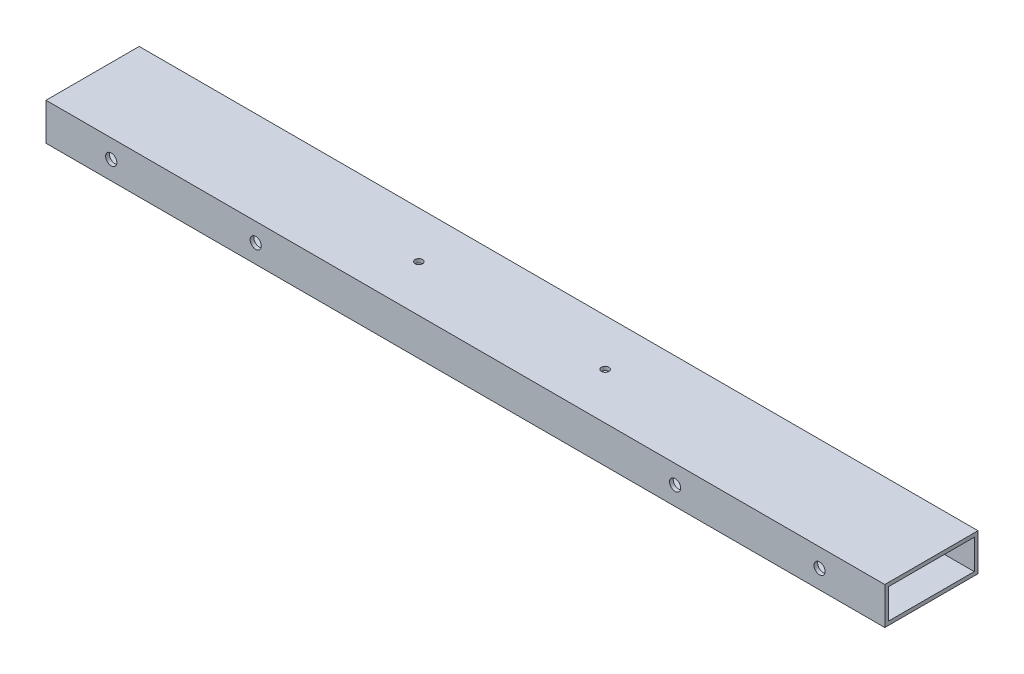
ISO-10303-21;
HEADER;
FILE_DESCRIPTION(('STEP AP214'),'2;1');
FILE_NAME('part.step','',(''),(''),'','','');
FILE_SCHEMA(('AUTOMOTIVE_DESIGN { 1 0 10303 214 1 1 1 1 }'));
ENDSEC;
DATA;
#1=APPLICATION_CONTEXT('core data for automotive mechanical design processes');
#2=APPLICATION_PROTOCOL_DEFINITION('international standard','automotive_design',2000,#1);
#3=PRODUCT_CONTEXT('',#1,'mechanical');
#4=PRODUCT('Part','Part','',(#3));
#5=PRODUCT_RELATED_PRODUCT_CATEGORY('part','',(#4));
#6=PRODUCT_DEFINITION_FORMATION('','',#4);
#7=PRODUCT_DEFINITION_CONTEXT('part definition',#1,'design');
#8=PRODUCT_DEFINITION('design','',#6,#7);
#9=PRODUCT_DEFINITION_SHAPE('','',#8);
#10=(LENGTH_UNIT() NAMED_UNIT(*) SI_UNIT(.MILLI.,.METRE.));
#11=(NAMED_UNIT(*) PLANE_ANGLE_UNIT() SI_UNIT($,.RADIAN.));
#12=(NAMED_UNIT(*) SI_UNIT($,.STERADIAN.) SOLID_ANGLE_UNIT());
#13=UNCERTAINTY_MEASURE_WITH_UNIT(LENGTH_MEASURE(1.E-05),#10,'distance_accuracy_value','');
#14=(GEOMETRIC_REPRESENTATION_CONTEXT(3) GLOBAL_UNCERTAINTY_ASSIGNED_CONTEXT((#13)) GLOBAL_UNIT_ASSIGNED_CONTEXT((#10,
#11,#12)) REPRESENTATION_CONTEXT('',''));
#15=CARTESIAN_POINT('',(0.,0.,0.));
#16=DIRECTION('',(0.,0.,1.));
#17=DIRECTION('',(1.,0.,0.));
#18=AXIS2_PLACEMENT_3D('',#15,#16,#17);
#19=CARTESIAN_POINT('',(450.,0.,0.));
#20=DIRECTION('',(1.,0.,0.));
#21=DIRECTION('',(0.,0.,-1.));
#22=AXIS2_PLACEMENT_3D('',#19,#20,#21);
#23=PLANE('',#22);
#24=DIRECTION('',(0.,1.,0.));
#25=VECTOR('',#24,1.);
#26=CARTESIAN_POINT('',(450.,10.,-25.));
#27=LINE('',#26,#25);
#28=CARTESIAN_POINT('',(450.,-10.,-25.));
#29=VERTEX_POINT('',#28);
#30=CARTESIAN_POINT('',(450.,10.,-25.));
#31=VERTEX_POINT('',#30);
#32=EDGE_CURVE('E141',#29,#31,#27,.T.);
#33=ORIENTED_EDGE('',*,*,#32,.T.);
#34=DIRECTION('',(0.,0.,1.));
#35=VECTOR('',#34,1.);
#36=CARTESIAN_POINT('',(450.,10.,25.));
#37=LINE('',#36,#35);
#38=CARTESIAN_POINT('',(450.,10.,25.));
#39=VERTEX_POINT('',#38);
#40=EDGE_CURVE('E144',#31,#39,#37,.T.);
#41=ORIENTED_EDGE('',*,*,#40,.T.);
#42=DIRECTION('',(0.,-1.,0.));
#43=VECTOR('',#42,1.);
#44=CARTESIAN_POINT('',(450.,10.,25.));
#45=LINE('',#44,#43);
#46=CARTESIAN_POINT('',(450.,-10.,25.));
#47=VERTEX_POINT('',#46);
#48=EDGE_CURVE('E147',#39,#47,#45,.T.);
#49=ORIENTED_EDGE('',*,*,#48,.T.);
#50=DIRECTION('',(0.,0.,-1.));
#51=VECTOR('',#50,1.);
#52=CARTESIAN_POINT('',(450.,-10.,25.));
#53=LINE('',#52,#51);
#54=EDGE_CURVE('E149',#47,#29,#53,.T.);
#55=ORIENTED_EDGE('',*,*,#54,.T.);
#56=EDGE_LOOP('',(#33,#41,#49,#55));
#57=FACE_BOUND('',#56,.T.);
#58=DIRECTION('',(0.,0.,1.));
#59=VECTOR('',#58,1.);
#60=CARTESIAN_POINT('',(450.,8.,23.));
#61=LINE('',#60,#59);
#62=CARTESIAN_POINT('',(450.,8.,-23.));
#63=VERTEX_POINT('',#62);
#64=CARTESIAN_POINT('',(450.,8.,23.));
#65=VERTEX_POINT('',#64);
#66=EDGE_CURVE('E111',#63,#65,#61,.T.);
#67=ORIENTED_EDGE('',*,*,#66,.F.);
#68=DIRECTION('',(0.,1.,0.));
#69=VECTOR('',#68,1.);
#70=CARTESIAN_POINT('',(450.,-8.,-23.));
#71=LINE('',#70,#69);
#72=CARTESIAN_POINT('',(450.,-8.,-23.));
#73=VERTEX_POINT('',#72);
#74=EDGE_CURVE('E103',#73,#63,#71,.T.);
#75=ORIENTED_EDGE('',*,*,#74,.F.);
#76=DIRECTION('',(0.,0.,-1.));
#77=VECTOR('',#76,1.);
#78=CARTESIAN_POINT('',(450.,-8.,23.));
#79=LINE('',#78,#77);
#80=CARTESIAN_POINT('',(450.,-8.,23.));
#81=VERTEX_POINT('',#80);
#82=EDGE_CURVE('E125',#81,#73,#79,.T.);
#83=ORIENTED_EDGE('',*,*,#82,.F.);
#84=DIRECTION('',(0.,-1.,0.));
#85=VECTOR('',#84,1.);
#86=CARTESIAN_POINT('',(450.,-8.,23.));
#87=LINE('',#86,#85);
#88=EDGE_CURVE('E123',#65,#81,#87,.T.);
#89=ORIENTED_EDGE('',*,*,#88,.F.);
#90=EDGE_LOOP('',(#67,#75,#83,#89));
#91=FACE_BOUND('',#90,.T.);
#92=ADVANCED_FACE('F36',(#57,#91),#23,.T.);
#93=CARTESIAN_POINT('',(0.,0.,0.));
#94=DIRECTION('',(1.,0.,0.));
#95=DIRECTION('',(0.,0.,-1.));
#96=AXIS2_PLACEMENT_3D('',#93,#94,#95);
#97=PLANE('',#96);
#98=DIRECTION('',(0.,1.,0.));
#99=VECTOR('',#98,1.);
#100=CARTESIAN_POINT('',(0.,10.,-25.));
#101=LINE('',#100,#99);
#102=CARTESIAN_POINT('',(0.,-10.,-25.));
#103=VERTEX_POINT('',#102);
#104=CARTESIAN_POINT('',(0.,10.,-25.));
#105=VERTEX_POINT('',#104);
#106=EDGE_CURVE('E119',#103,#105,#101,.T.);
#107=ORIENTED_EDGE('',*,*,#106,.F.);
#108=DIRECTION('',(0.,0.,-1.));
#109=VECTOR('',#108,1.);
#110=CARTESIAN_POINT('',(0.,-10.,25.));
#111=LINE('',#110,#109);
#112=CARTESIAN_POINT('',(0.,-10.,25.));
#113=VERTEX_POINT('',#112);
#114=EDGE_CURVE('E145',#113,#103,#111,.T.);
#115=ORIENTED_EDGE('',*,*,#114,.F.);
#116=DIRECTION('',(0.,-1.,0.));
#117=VECTOR('',#116,1.);
#118=CARTESIAN_POINT('',(0.,10.,25.));
#119=LINE('',#118,#117);
#120=CARTESIAN_POINT('',(0.,10.,25.));
#121=VERTEX_POINT('',#120);
#122=EDGE_CURVE('E156',#121,#113,#119,.T.);
#123=ORIENTED_EDGE('',*,*,#122,.F.);
#124=DIRECTION('',(0.,0.,1.));
#125=VECTOR('',#124,1.);
#126=CARTESIAN_POINT('',(0.,10.,25.));
#127=LINE('',#126,#125);
#128=EDGE_CURVE('E154',#105,#121,#127,.T.);
#129=ORIENTED_EDGE('',*,*,#128,.F.);
#130=EDGE_LOOP('',(#107,#115,#123,#129));
#131=FACE_BOUND('',#130,.T.);
#132=DIRECTION('',(0.,1.,0.));
#133=VECTOR('',#132,1.);
#134=CARTESIAN_POINT('',(0.,-8.,-23.));
#135=LINE('',#134,#133);
#136=CARTESIAN_POINT('',(0.,-8.,-23.));
#137=VERTEX_POINT('',#136);
#138=CARTESIAN_POINT('',(0.,8.,-23.));
#139=VERTEX_POINT('',#138);
#140=EDGE_CURVE('E61',#137,#139,#135,.T.);
#141=ORIENTED_EDGE('',*,*,#140,.T.);
#142=DIRECTION('',(0.,0.,1.));
#143=VECTOR('',#142,1.);
#144=CARTESIAN_POINT('',(0.,8.,23.));
#145=LINE('',#144,#143);
#146=CARTESIAN_POINT('',(0.,8.,23.));
#147=VERTEX_POINT('',#146);
#148=EDGE_CURVE('E118',#139,#147,#145,.T.);
#149=ORIENTED_EDGE('',*,*,#148,.T.);
#150=DIRECTION('',(0.,-1.,0.));
#151=VECTOR('',#150,1.);
#152=CARTESIAN_POINT('',(0.,-8.,23.));
#153=LINE('',#152,#151);
#154=CARTESIAN_POINT('',(0.,-8.,23.));
#155=VERTEX_POINT('',#154);
#156=EDGE_CURVE('E133',#147,#155,#153,.T.);
#157=ORIENTED_EDGE('',*,*,#156,.T.);
#158=DIRECTION('',(0.,0.,-1.));
#159=VECTOR('',#158,1.);
#160=CARTESIAN_POINT('',(0.,-8.,23.));
#161=LINE('',#160,#159);
#162=EDGE_CURVE('E112',#155,#137,#161,.T.);
#163=ORIENTED_EDGE('',*,*,#162,.T.);
#164=EDGE_LOOP('',(#141,#149,#157,#163));
#165=FACE_BOUND('',#164,.T.);
#166=ADVANCED_FACE('F262',(#131,#165),#97,.F.);
#167=CARTESIAN_POINT('',(450.,10.,-25.));
#168=DIRECTION('',(0.,0.,1.));
#169=DIRECTION('',(1.,0.,0.));
#170=AXIS2_PLACEMENT_3D('',#167,#168,#169);
#171=PLANE('',#170);
#172=CARTESIAN_POINT('',(415.,0.,-25.));
#173=DIRECTION('',(0.,0.,-1.));
#174=DIRECTION('',(-1.,0.,0.));
#175=AXIS2_PLACEMENT_3D('',#172,#173,#174);
#176=CIRCLE('',#175,2.99999999999999);
#177=CARTESIAN_POINT('',(412.,0.,-25.));
#178=VERTEX_POINT('',#177);
#179=EDGE_CURVE('E207',#178,#178,#176,.T.);
#180=ORIENTED_EDGE('',*,*,#179,.F.);
#181=EDGE_LOOP('',(#180));
#182=FACE_BOUND('',#181,.T.);
#183=CARTESIAN_POINT('',(337.5,0.,-25.));
#184=DIRECTION('',(0.,0.,-1.));
#185=DIRECTION('',(-1.,0.,0.));
#186=AXIS2_PLACEMENT_3D('',#183,#184,#185);
#187=CIRCLE('',#186,2.99999999999999);
#188=CARTESIAN_POINT('',(334.5,0.,-25.));
#189=VERTEX_POINT('',#188);
#190=EDGE_CURVE('E213',#189,#189,#187,.T.);
#191=ORIENTED_EDGE('',*,*,#190,.F.);
#192=EDGE_LOOP('',(#191));
#193=FACE_BOUND('',#192,.T.);
#194=CARTESIAN_POINT('',(112.5,0.,-25.));
#195=DIRECTION('',(0.,0.,-1.));
#196=DIRECTION('',(-1.,0.,0.));
#197=AXIS2_PLACEMENT_3D('',#194,#195,#196);
#198=CIRCLE('',#197,2.99999999999999);
#199=CARTESIAN_POINT('',(109.5,0.,-25.));
#200=VERTEX_POINT('',#199);
#201=EDGE_CURVE('E219',#200,#200,#198,.T.);
#202=ORIENTED_EDGE('',*,*,#201,.F.);
#203=EDGE_LOOP('',(#202));
#204=FACE_BOUND('',#203,.T.);
#205=CARTESIAN_POINT('',(35.,0.,-25.));
#206=DIRECTION('',(0.,0.,-1.));
#207=DIRECTION('',(-1.,0.,0.));
#208=AXIS2_PLACEMENT_3D('',#205,#206,#207);
#209=CIRCLE('',#208,2.99999999999999);
#210=CARTESIAN_POINT('',(32.,0.,-25.));
#211=VERTEX_POINT('',#210);
#212=EDGE_CURVE('E206',#211,#211,#209,.T.);
#213=ORIENTED_EDGE('',*,*,#212,.F.);
#214=EDGE_LOOP('',(#213));
#215=FACE_BOUND('',#214,.T.);
#216=ORIENTED_EDGE('',*,*,#106,.T.);
#217=DIRECTION('',(-1.,0.,0.));
#218=VECTOR('',#217,1.);
#219=CARTESIAN_POINT('',(450.,10.,-25.));
#220=LINE('',#219,#218);
#221=EDGE_CURVE('E11',#31,#105,#220,.T.);
#222=ORIENTED_EDGE('',*,*,#221,.F.);
#223=ORIENTED_EDGE('',*,*,#32,.F.);
#224=DIRECTION('',(-1.,0.,0.));
#225=VECTOR('',#224,1.);
#226=CARTESIAN_POINT('',(450.,-10.,-25.));
#227=LINE('',#226,#225);
#228=EDGE_CURVE('E151',#29,#103,#227,.T.);
#229=ORIENTED_EDGE('',*,*,#228,.T.);
#230=EDGE_LOOP('',(#216,#222,#223,#229));
#231=FACE_BOUND('',#230,.T.);
#232=ADVANCED_FACE('F38',(#182,#193,#204,#215,#231),#171,.F.);
#233=CARTESIAN_POINT('',(450.,10.,25.));
#234=DIRECTION('',(0.,-1.,0.));
#235=DIRECTION('',(0.,0.,-1.));
#236=AXIS2_PLACEMENT_3D('',#233,#234,#235);
#237=PLANE('',#236);
#238=CARTESIAN_POINT('',(175.,10.,0.));
#239=DIRECTION('',(0.,1.,0.));
#240=DIRECTION('',(0.,0.,1.));
#241=AXIS2_PLACEMENT_3D('',#238,#239,#240);
#242=CIRCLE('',#241,2.);
#243=CARTESIAN_POINT('',(175.,10.,2.));
#244=VERTEX_POINT('',#243);
#245=EDGE_CURVE('E190',#244,#244,#242,.T.);
#246=ORIENTED_EDGE('',*,*,#245,.F.);
#247=EDGE_LOOP('',(#246));
#248=FACE_BOUND('',#247,.T.);
#249=CARTESIAN_POINT('',(275.,10.,0.));
#250=DIRECTION('',(0.,1.,0.));
#251=DIRECTION('',(0.,0.,1.));
#252=AXIS2_PLACEMENT_3D('',#249,#250,#251);
#253=CIRCLE('',#252,2.);
#254=CARTESIAN_POINT('',(275.,10.,2.));
#255=VERTEX_POINT('',#254);
#256=EDGE_CURVE('E198',#255,#255,#253,.T.);
#257=ORIENTED_EDGE('',*,*,#256,.F.);
#258=EDGE_LOOP('',(#257));
#259=FACE_BOUND('',#258,.T.);
#260=ORIENTED_EDGE('',*,*,#128,.T.);
#261=DIRECTION('',(-1.,0.,0.));
#262=VECTOR('',#261,1.);
#263=CARTESIAN_POINT('',(450.,10.,25.));
#264=LINE('',#263,#262);
#265=EDGE_CURVE('E45',#39,#121,#264,.T.);
#266=ORIENTED_EDGE('',*,*,#265,.F.);
#267=ORIENTED_EDGE('',*,*,#40,.F.);
#268=ORIENTED_EDGE('',*,*,#221,.T.);
#269=EDGE_LOOP('',(#260,#266,#267,#268));
#270=FACE_BOUND('',#269,.T.);
#271=ADVANCED_FACE('F261',(#248,#259,#270),#237,.F.);
#272=CARTESIAN_POINT('',(450.,10.,25.));
#273=DIRECTION('',(0.,0.,-1.));
#274=DIRECTION('',(-1.,0.,0.));
#275=AXIS2_PLACEMENT_3D('',#272,#273,#274);
#276=PLANE('',#275);
#277=CARTESIAN_POINT('',(415.,0.,25.));
#278=DIRECTION('',(0.,0.,-1.));
#279=DIRECTION('',(-1.,0.,0.));
#280=AXIS2_PLACEMENT_3D('',#277,#278,#279);
#281=CIRCLE('',#280,2.99999999999999);
#282=CARTESIAN_POINT('',(412.,0.,25.));
#283=VERTEX_POINT('',#282);
#284=EDGE_CURVE('E170',#283,#283,#281,.F.);
#285=ORIENTED_EDGE('',*,*,#284,.F.);
#286=EDGE_LOOP('',(#285));
#287=FACE_BOUND('',#286,.T.);
#288=CARTESIAN_POINT('',(337.5,0.,25.));
#289=DIRECTION('',(0.,0.,-1.));
#290=DIRECTION('',(-1.,0.,0.));
#291=AXIS2_PLACEMENT_3D('',#288,#289,#290);
#292=CIRCLE('',#291,2.99999999999999);
#293=CARTESIAN_POINT('',(334.5,0.,25.));
#294=VERTEX_POINT('',#293);
#295=EDGE_CURVE('E210',#294,#294,#292,.F.);
#296=ORIENTED_EDGE('',*,*,#295,.F.);
#297=EDGE_LOOP('',(#296));
#298=FACE_BOUND('',#297,.T.);
#299=CARTESIAN_POINT('',(112.5,0.,25.));
#300=DIRECTION('',(0.,0.,-1.));
#301=DIRECTION('',(-1.,0.,0.));
#302=AXIS2_PLACEMENT_3D('',#299,#300,#301);
#303=CIRCLE('',#302,2.99999999999999);
#304=CARTESIAN_POINT('',(109.5,0.,25.));
#305=VERTEX_POINT('',#304);
#306=EDGE_CURVE('E216',#305,#305,#303,.F.);
#307=ORIENTED_EDGE('',*,*,#306,.F.);
#308=EDGE_LOOP('',(#307));
#309=FACE_BOUND('',#308,.T.);
#310=CARTESIAN_POINT('',(35.,0.,25.));
#311=DIRECTION('',(0.,0.,-1.));
#312=DIRECTION('',(-1.,0.,0.));
#313=AXIS2_PLACEMENT_3D('',#310,#311,#312);
#314=CIRCLE('',#313,2.99999999999999);
#315=CARTESIAN_POINT('',(32.,0.,25.));
#316=VERTEX_POINT('',#315);
#317=EDGE_CURVE('E222',#316,#316,#314,.F.);
#318=ORIENTED_EDGE('',*,*,#317,.F.);
#319=EDGE_LOOP('',(#318));
#320=FACE_BOUND('',#319,.T.);
#321=ORIENTED_EDGE('',*,*,#122,.T.);
#322=DIRECTION('',(-1.,0.,0.));
#323=VECTOR('',#322,1.);
#324=CARTESIAN_POINT('',(450.,-10.,25.));
#325=LINE('',#324,#323);
#326=EDGE_CURVE('E161',#47,#113,#325,.T.);
#327=ORIENTED_EDGE('',*,*,#326,.F.);
#328=ORIENTED_EDGE('',*,*,#48,.F.);
#329=ORIENTED_EDGE('',*,*,#265,.T.);
#330=EDGE_LOOP('',(#321,#327,#328,#329));
#331=FACE_BOUND('',#330,.T.);
#332=ADVANCED_FACE('F280',(#287,#298,#309,#320,#331),#276,.F.);
#333=CARTESIAN_POINT('',(450.,-10.,25.));
#334=DIRECTION('',(0.,1.,0.));
#335=DIRECTION('',(0.,0.,1.));
#336=AXIS2_PLACEMENT_3D('',#333,#334,#335);
#337=PLANE('',#336);
#338=CARTESIAN_POINT('',(175.,-10.,0.));
#339=DIRECTION('',(0.,1.,0.));
#340=DIRECTION('',(0.,0.,1.));
#341=AXIS2_PLACEMENT_3D('',#338,#339,#340);
#342=CIRCLE('',#341,2.);
#343=CARTESIAN_POINT('',(175.,-10.,2.));
#344=VERTEX_POINT('',#343);
#345=EDGE_CURVE('E184',#344,#344,#342,.F.);
#346=ORIENTED_EDGE('',*,*,#345,.F.);
#347=EDGE_LOOP('',(#346));
#348=FACE_BOUND('',#347,.T.);
#349=CARTESIAN_POINT('',(275.,-10.,0.));
#350=DIRECTION('',(0.,1.,0.));
#351=DIRECTION('',(0.,0.,1.));
#352=AXIS2_PLACEMENT_3D('',#349,#350,#351);
#353=CIRCLE('',#352,2.);
#354=CARTESIAN_POINT('',(275.,-10.,2.));
#355=VERTEX_POINT('',#354);
#356=EDGE_CURVE('E195',#355,#355,#353,.F.);
#357=ORIENTED_EDGE('',*,*,#356,.F.);
#358=EDGE_LOOP('',(#357));
#359=FACE_BOUND('',#358,.T.);
#360=ORIENTED_EDGE('',*,*,#114,.T.);
#361=ORIENTED_EDGE('',*,*,#228,.F.);
#362=ORIENTED_EDGE('',*,*,#54,.F.);
#363=ORIENTED_EDGE('',*,*,#326,.T.);
#364=EDGE_LOOP('',(#360,#361,#362,#363));
#365=FACE_BOUND('',#364,.T.);
#366=ADVANCED_FACE('F242',(#348,#359,#365),#337,.F.);
#367=CARTESIAN_POINT('',(450.,-8.,-23.));
#368=DIRECTION('',(0.,0.,1.));
#369=DIRECTION('',(1.,0.,0.));
#370=AXIS2_PLACEMENT_3D('',#367,#368,#369);
#371=PLANE('',#370);
#372=CARTESIAN_POINT('',(415.,0.,-23.));
#373=DIRECTION('',(0.,0.,1.));
#374=DIRECTION('',(1.,0.,0.));
#375=AXIS2_PLACEMENT_3D('',#372,#373,#374);
#376=CIRCLE('',#375,2.99999999999999);
#377=CARTESIAN_POINT('',(418.,0.,-23.));
#378=VERTEX_POINT('',#377);
#379=EDGE_CURVE('E131',#378,#378,#376,.T.);
#380=ORIENTED_EDGE('',*,*,#379,.F.);
#381=EDGE_LOOP('',(#380));
#382=FACE_BOUND('',#381,.T.);
#383=CARTESIAN_POINT('',(337.5,0.,-23.));
#384=DIRECTION('',(0.,0.,1.));
#385=DIRECTION('',(1.,0.,0.));
#386=AXIS2_PLACEMENT_3D('',#383,#384,#385);
#387=CIRCLE('',#386,2.99999999999999);
#388=CARTESIAN_POINT('',(340.5,0.,-23.));
#389=VERTEX_POINT('',#388);
#390=EDGE_CURVE('E178',#389,#389,#387,.T.);
#391=ORIENTED_EDGE('',*,*,#390,.F.);
#392=EDGE_LOOP('',(#391));
#393=FACE_BOUND('',#392,.T.);
#394=CARTESIAN_POINT('',(112.5,0.,-23.));
#395=DIRECTION('',(0.,0.,1.));
#396=DIRECTION('',(1.,0.,0.));
#397=AXIS2_PLACEMENT_3D('',#394,#395,#396);
#398=CIRCLE('',#397,2.99999999999999);
#399=CARTESIAN_POINT('',(115.5,0.,-23.));
#400=VERTEX_POINT('',#399);
#401=EDGE_CURVE('E174',#400,#400,#398,.T.);
#402=ORIENTED_EDGE('',*,*,#401,.F.);
#403=EDGE_LOOP('',(#402));
#404=FACE_BOUND('',#403,.T.);
#405=CARTESIAN_POINT('',(35.,0.,-23.));
#406=DIRECTION('',(0.,0.,1.));
#407=DIRECTION('',(1.,0.,0.));
#408=AXIS2_PLACEMENT_3D('',#405,#406,#407);
#409=CIRCLE('',#408,2.99999999999999);
#410=CARTESIAN_POINT('',(38.,0.,-23.));
#411=VERTEX_POINT('',#410);
#412=EDGE_CURVE('E169',#411,#411,#409,.T.);
#413=ORIENTED_EDGE('',*,*,#412,.F.);
#414=EDGE_LOOP('',(#413));
#415=FACE_BOUND('',#414,.T.);
#416=ORIENTED_EDGE('',*,*,#140,.F.);
#417=DIRECTION('',(-1.,0.,0.));
#418=VECTOR('',#417,1.);
#419=CARTESIAN_POINT('',(450.,-8.,-23.));
#420=LINE('',#419,#418);
#421=EDGE_CURVE('E107',#73,#137,#420,.T.);
#422=ORIENTED_EDGE('',*,*,#421,.F.);
#423=ORIENTED_EDGE('',*,*,#74,.T.);
#424=DIRECTION('',(-1.,0.,0.));
#425=VECTOR('',#424,1.);
#426=CARTESIAN_POINT('',(450.,8.,-23.));
#427=LINE('',#426,#425);
#428=EDGE_CURVE('E106',#63,#139,#427,.T.);
#429=ORIENTED_EDGE('',*,*,#428,.T.);
#430=EDGE_LOOP('',(#416,#422,#423,#429));
#431=FACE_BOUND('',#430,.T.);
#432=ADVANCED_FACE('F105',(#382,#393,#404,#415,#431),#371,.T.);
#433=CARTESIAN_POINT('',(450.,8.,23.));
#434=DIRECTION('',(0.,-1.,0.));
#435=DIRECTION('',(0.,0.,-1.));
#436=AXIS2_PLACEMENT_3D('',#433,#434,#435);
#437=PLANE('',#436);
#438=CARTESIAN_POINT('',(175.,8.,0.));
#439=DIRECTION('',(0.,-1.,0.));
#440=DIRECTION('',(0.,0.,-1.));
#441=AXIS2_PLACEMENT_3D('',#438,#439,#440);
#442=CIRCLE('',#441,2.);
#443=CARTESIAN_POINT('',(175.,8.,-2.));
#444=VERTEX_POINT('',#443);
#445=EDGE_CURVE('E203',#444,#444,#442,.T.);
#446=ORIENTED_EDGE('',*,*,#445,.F.);
#447=EDGE_LOOP('',(#446));
#448=FACE_BOUND('',#447,.T.);
#449=CARTESIAN_POINT('',(275.,8.,0.));
#450=DIRECTION('',(0.,-1.,0.));
#451=DIRECTION('',(0.,0.,-1.));
#452=AXIS2_PLACEMENT_3D('',#449,#450,#451);
#453=CIRCLE('',#452,2.);
#454=CARTESIAN_POINT('',(275.,8.,-2.));
#455=VERTEX_POINT('',#454);
#456=EDGE_CURVE('E183',#455,#455,#453,.T.);
#457=ORIENTED_EDGE('',*,*,#456,.F.);
#458=EDGE_LOOP('',(#457));
#459=FACE_BOUND('',#458,.T.);
#460=ORIENTED_EDGE('',*,*,#148,.F.);
#461=ORIENTED_EDGE('',*,*,#428,.F.);
#462=ORIENTED_EDGE('',*,*,#66,.T.);
#463=DIRECTION('',(-1.,0.,0.));
#464=VECTOR('',#463,1.);
#465=CARTESIAN_POINT('',(450.,8.,23.));
#466=LINE('',#465,#464);
#467=EDGE_CURVE('E120',#65,#147,#466,.T.);
#468=ORIENTED_EDGE('',*,*,#467,.T.);
#469=EDGE_LOOP('',(#460,#461,#462,#468));
#470=FACE_BOUND('',#469,.T.);
#471=ADVANCED_FACE('F115',(#448,#459,#470),#437,.T.);
#472=CARTESIAN_POINT('',(450.,-8.,23.));
#473=DIRECTION('',(0.,0.,-1.));
#474=DIRECTION('',(-1.,0.,0.));
#475=AXIS2_PLACEMENT_3D('',#472,#473,#474);
#476=PLANE('',#475);
#477=CARTESIAN_POINT('',(415.,0.,23.));
#478=DIRECTION('',(0.,0.,-1.));
#479=DIRECTION('',(-1.,0.,0.));
#480=AXIS2_PLACEMENT_3D('',#477,#478,#479);
#481=CIRCLE('',#480,2.99999999999999);
#482=CARTESIAN_POINT('',(412.,0.,23.));
#483=VERTEX_POINT('',#482);
#484=EDGE_CURVE('E179',#483,#483,#481,.T.);
#485=ORIENTED_EDGE('',*,*,#484,.F.);
#486=EDGE_LOOP('',(#485));
#487=FACE_BOUND('',#486,.T.);
#488=CARTESIAN_POINT('',(337.5,0.,23.));
#489=DIRECTION('',(0.,0.,-1.));
#490=DIRECTION('',(-1.,0.,0.));
#491=AXIS2_PLACEMENT_3D('',#488,#489,#490);
#492=CIRCLE('',#491,2.99999999999999);
#493=CARTESIAN_POINT('',(334.5,0.,23.));
#494=VERTEX_POINT('',#493);
#495=EDGE_CURVE('E175',#494,#494,#492,.T.);
#496=ORIENTED_EDGE('',*,*,#495,.F.);
#497=EDGE_LOOP('',(#496));
#498=FACE_BOUND('',#497,.T.);
#499=CARTESIAN_POINT('',(112.5,0.,23.));
#500=DIRECTION('',(0.,0.,-1.));
#501=DIRECTION('',(-1.,0.,0.));
#502=AXIS2_PLACEMENT_3D('',#499,#500,#501);
#503=CIRCLE('',#502,2.99999999999999);
#504=CARTESIAN_POINT('',(109.5,0.,23.));
#505=VERTEX_POINT('',#504);
#506=EDGE_CURVE('E171',#505,#505,#503,.T.);
#507=ORIENTED_EDGE('',*,*,#506,.F.);
#508=EDGE_LOOP('',(#507));
#509=FACE_BOUND('',#508,.T.);
#510=CARTESIAN_POINT('',(35.,0.,23.));
#511=DIRECTION('',(0.,0.,-1.));
#512=DIRECTION('',(-1.,0.,0.));
#513=AXIS2_PLACEMENT_3D('',#510,#511,#512);
#514=CIRCLE('',#513,2.99999999999999);
#515=CARTESIAN_POINT('',(32.,0.,23.));
#516=VERTEX_POINT('',#515);
#517=EDGE_CURVE('E166',#516,#516,#514,.T.);
#518=ORIENTED_EDGE('',*,*,#517,.F.);
#519=EDGE_LOOP('',(#518));
#520=FACE_BOUND('',#519,.T.);
#521=ORIENTED_EDGE('',*,*,#156,.F.);
#522=ORIENTED_EDGE('',*,*,#467,.F.);
#523=ORIENTED_EDGE('',*,*,#88,.T.);
#524=DIRECTION('',(-1.,0.,0.));
#525=VECTOR('',#524,1.);
#526=CARTESIAN_POINT('',(450.,-8.,23.));
#527=LINE('',#526,#525);
#528=EDGE_CURVE('E53',#81,#155,#527,.T.);
#529=ORIENTED_EDGE('',*,*,#528,.T.);
#530=EDGE_LOOP('',(#521,#522,#523,#529));
#531=FACE_BOUND('',#530,.T.);
#532=ADVANCED_FACE('F302',(#487,#498,#509,#520,#531),#476,.T.);
#533=CARTESIAN_POINT('',(450.,-8.,23.));
#534=DIRECTION('',(0.,1.,0.));
#535=DIRECTION('',(0.,0.,1.));
#536=AXIS2_PLACEMENT_3D('',#533,#534,#535);
#537=PLANE('',#536);
#538=CARTESIAN_POINT('',(175.,-8.,0.));
#539=DIRECTION('',(0.,1.,0.));
#540=DIRECTION('',(0.,0.,1.));
#541=AXIS2_PLACEMENT_3D('',#538,#539,#540);
#542=CIRCLE('',#541,2.);
#543=CARTESIAN_POINT('',(175.,-8.,2.));
#544=VERTEX_POINT('',#543);
#545=EDGE_CURVE('E40',#544,#544,#542,.T.);
#546=ORIENTED_EDGE('',*,*,#545,.F.);
#547=EDGE_LOOP('',(#546));
#548=FACE_BOUND('',#547,.T.);
#549=CARTESIAN_POINT('',(275.,-8.,0.));
#550=DIRECTION('',(0.,1.,0.));
#551=DIRECTION('',(0.,0.,1.));
#552=AXIS2_PLACEMENT_3D('',#549,#550,#551);
#553=CIRCLE('',#552,2.);
#554=CARTESIAN_POINT('',(275.,-8.,2.));
#555=VERTEX_POINT('',#554);
#556=EDGE_CURVE('E181',#555,#555,#553,.T.);
#557=ORIENTED_EDGE('',*,*,#556,.F.);
#558=EDGE_LOOP('',(#557));
#559=FACE_BOUND('',#558,.T.);
#560=ORIENTED_EDGE('',*,*,#162,.F.);
#561=ORIENTED_EDGE('',*,*,#528,.F.);
#562=ORIENTED_EDGE('',*,*,#82,.T.);
#563=ORIENTED_EDGE('',*,*,#421,.T.);
#564=EDGE_LOOP('',(#560,#561,#562,#563));
#565=FACE_BOUND('',#564,.T.);
#566=ADVANCED_FACE('F306',(#548,#559,#565),#537,.T.);
#567=CARTESIAN_POINT('',(35.,0.,33.4852813742386));
#568=DIRECTION('',(0.,0.,-1.));
#569=DIRECTION('',(-1.,0.,0.));
#570=AXIS2_PLACEMENT_3D('',#567,#568,#569);
#571=CYLINDRICAL_SURFACE('',#570,2.99999999999999);
#572=ORIENTED_EDGE('',*,*,#517,.T.);
#573=EDGE_LOOP('',(#572));
#574=FACE_BOUND('',#573,.T.);
#575=ORIENTED_EDGE('',*,*,#317,.T.);
#576=EDGE_LOOP('',(#575));
#577=FACE_BOUND('',#576,.T.);
#578=ADVANCED_FACE('F256',(#574,#577),#571,.F.);
#579=CARTESIAN_POINT('',(112.5,0.,33.4852813742386));
#580=DIRECTION('',(0.,0.,-1.));
#581=DIRECTION('',(-1.,0.,0.));
#582=AXIS2_PLACEMENT_3D('',#579,#580,#581);
#583=CYLINDRICAL_SURFACE('',#582,2.99999999999999);
#584=ORIENTED_EDGE('',*,*,#506,.T.);
#585=EDGE_LOOP('',(#584));
#586=FACE_BOUND('',#585,.T.);
#587=ORIENTED_EDGE('',*,*,#306,.T.);
#588=EDGE_LOOP('',(#587));
#589=FACE_BOUND('',#588,.T.);
#590=ADVANCED_FACE('F312',(#586,#589),#583,.F.);
#591=CARTESIAN_POINT('',(337.5,0.,33.4852813742386));
#592=DIRECTION('',(0.,0.,-1.));
#593=DIRECTION('',(-1.,0.,0.));
#594=AXIS2_PLACEMENT_3D('',#591,#592,#593);
#595=CYLINDRICAL_SURFACE('',#594,2.99999999999999);
#596=ORIENTED_EDGE('',*,*,#495,.T.);
#597=EDGE_LOOP('',(#596));
#598=FACE_BOUND('',#597,.T.);
#599=ORIENTED_EDGE('',*,*,#295,.T.);
#600=EDGE_LOOP('',(#599));
#601=FACE_BOUND('',#600,.T.);
#602=ADVANCED_FACE('F316',(#598,#601),#595,.F.);
#603=CARTESIAN_POINT('',(415.,0.,33.4852813742386));
#604=DIRECTION('',(0.,0.,-1.));
#605=DIRECTION('',(-1.,0.,0.));
#606=AXIS2_PLACEMENT_3D('',#603,#604,#605);
#607=CYLINDRICAL_SURFACE('',#606,2.99999999999999);
#608=ORIENTED_EDGE('',*,*,#484,.T.);
#609=EDGE_LOOP('',(#608));
#610=FACE_BOUND('',#609,.T.);
#611=ORIENTED_EDGE('',*,*,#284,.T.);
#612=EDGE_LOOP('',(#611));
#613=FACE_BOUND('',#612,.T.);
#614=ADVANCED_FACE('F254',(#610,#613),#607,.F.);
#615=ORIENTED_EDGE('',*,*,#412,.T.);
#616=EDGE_LOOP('',(#615));
#617=FACE_BOUND('',#616,.T.);
#618=ORIENTED_EDGE('',*,*,#212,.T.);
#619=EDGE_LOOP('',(#618));
#620=FACE_BOUND('',#619,.T.);
#621=ADVANCED_FACE('F250',(#617,#620),#571,.F.);
#622=ORIENTED_EDGE('',*,*,#401,.T.);
#623=EDGE_LOOP('',(#622));
#624=FACE_BOUND('',#623,.T.);
#625=ORIENTED_EDGE('',*,*,#201,.T.);
#626=EDGE_LOOP('',(#625));
#627=FACE_BOUND('',#626,.T.);
#628=ADVANCED_FACE('F253',(#624,#627),#583,.F.);
#629=ORIENTED_EDGE('',*,*,#390,.T.);
#630=EDGE_LOOP('',(#629));
#631=FACE_BOUND('',#630,.T.);
#632=ORIENTED_EDGE('',*,*,#190,.T.);
#633=EDGE_LOOP('',(#632));
#634=FACE_BOUND('',#633,.T.);
#635=ADVANCED_FACE('F321',(#631,#634),#595,.F.);
#636=ORIENTED_EDGE('',*,*,#379,.T.);
#637=EDGE_LOOP('',(#636));
#638=FACE_BOUND('',#637,.T.);
#639=ORIENTED_EDGE('',*,*,#179,.T.);
#640=EDGE_LOOP('',(#639));
#641=FACE_BOUND('',#640,.T.);
#642=ADVANCED_FACE('F237',(#638,#641),#607,.F.);
#643=CARTESIAN_POINT('',(275.,-15.6568542494924,0.));
#644=DIRECTION('',(0.,1.,0.));
#645=DIRECTION('',(0.,0.,1.));
#646=AXIS2_PLACEMENT_3D('',#643,#644,#645);
#647=CYLINDRICAL_SURFACE('',#646,2.);
#648=ORIENTED_EDGE('',*,*,#556,.T.);
#649=EDGE_LOOP('',(#648));
#650=FACE_BOUND('',#649,.T.);
#651=ORIENTED_EDGE('',*,*,#356,.T.);
#652=EDGE_LOOP('',(#651));
#653=FACE_BOUND('',#652,.T.);
#654=ADVANCED_FACE('F325',(#650,#653),#647,.F.);
#655=CARTESIAN_POINT('',(175.,-15.6568542494924,0.));
#656=DIRECTION('',(0.,1.,0.));
#657=DIRECTION('',(0.,0.,1.));
#658=AXIS2_PLACEMENT_3D('',#655,#656,#657);
#659=CYLINDRICAL_SURFACE('',#658,2.);
#660=ORIENTED_EDGE('',*,*,#545,.T.);
#661=EDGE_LOOP('',(#660));
#662=FACE_BOUND('',#661,.T.);
#663=ORIENTED_EDGE('',*,*,#345,.T.);
#664=EDGE_LOOP('',(#663));
#665=FACE_BOUND('',#664,.T.);
#666=ADVANCED_FACE('F328',(#662,#665),#659,.F.);
#667=ORIENTED_EDGE('',*,*,#456,.T.);
#668=EDGE_LOOP('',(#667));
#669=FACE_BOUND('',#668,.T.);
#670=ORIENTED_EDGE('',*,*,#256,.T.);
#671=EDGE_LOOP('',(#670));
#672=FACE_BOUND('',#671,.T.);
#673=ADVANCED_FACE('F329',(#669,#672),#647,.F.);
#674=ORIENTED_EDGE('',*,*,#445,.T.);
#675=EDGE_LOOP('',(#674));
#676=FACE_BOUND('',#675,.T.);
#677=ORIENTED_EDGE('',*,*,#245,.T.);
#678=EDGE_LOOP('',(#677));
#679=FACE_BOUND('',#678,.T.);
#680=ADVANCED_FACE('F332',(#676,#679),#659,.F.);
#681=CLOSED_SHELL('',(#92,#166,#232,#271,#332,#366,#432,#471,#532,#566,#578,#590,#602,#614,#621,
#628,#635,#642,#654,#666,#673,#680));
#682=MANIFOLD_SOLID_BREP('B2',#681);
#683=ADVANCED_BREP_SHAPE_REPRESENTATION('',(#18,#682),#14);
#684=SHAPE_DEFINITION_REPRESENTATION(#9,#683);
ENDSEC;
END-ISO-10303-21;
